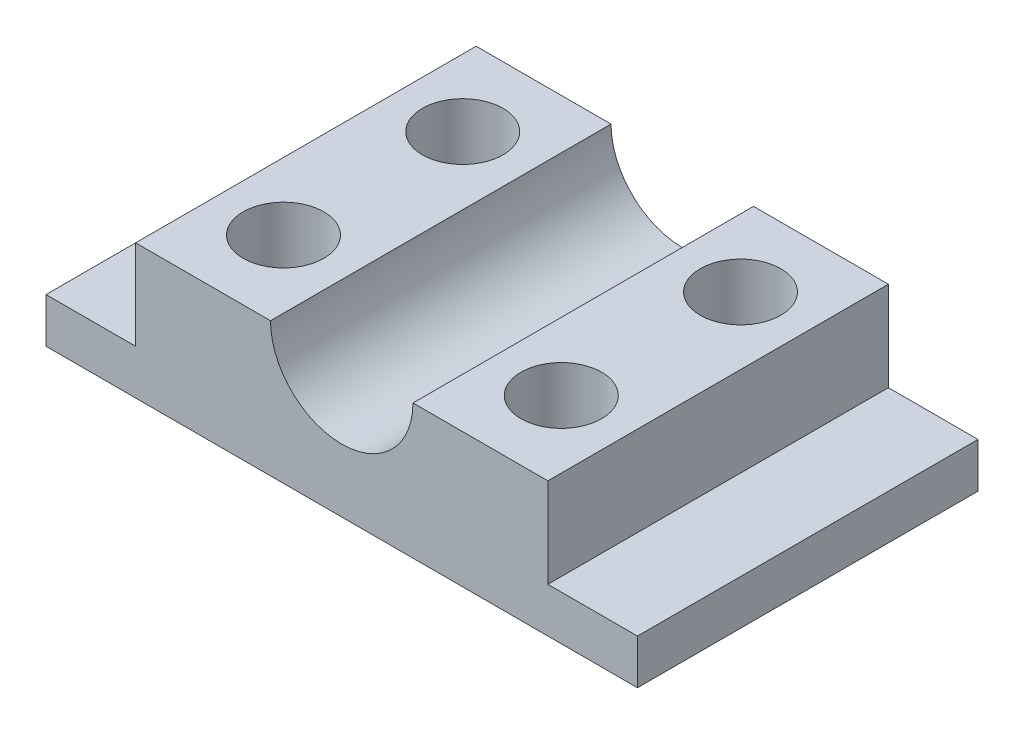
ISO-10303-21;
HEADER;
FILE_DESCRIPTION(('STEP AP214'),'2;1');
FILE_NAME('part.step','',(''),(''),'','','');
FILE_SCHEMA(('AUTOMOTIVE_DESIGN { 1 0 10303 214 1 1 1 1 }'));
ENDSEC;
DATA;
#1=APPLICATION_CONTEXT('core data for automotive mechanical design processes');
#2=APPLICATION_PROTOCOL_DEFINITION('international standard','automotive_design',2000,#1);
#3=PRODUCT_CONTEXT('',#1,'mechanical');
#4=PRODUCT('Part','Part','',(#3));
#5=PRODUCT_RELATED_PRODUCT_CATEGORY('part','',(#4));
#6=PRODUCT_DEFINITION_FORMATION('','',#4);
#7=PRODUCT_DEFINITION_CONTEXT('part definition',#1,'design');
#8=PRODUCT_DEFINITION('design','',#6,#7);
#9=PRODUCT_DEFINITION_SHAPE('','',#8);
#10=(LENGTH_UNIT() NAMED_UNIT(*) SI_UNIT(.MILLI.,.METRE.));
#11=(NAMED_UNIT(*) PLANE_ANGLE_UNIT() SI_UNIT($,.RADIAN.));
#12=(NAMED_UNIT(*) SI_UNIT($,.STERADIAN.) SOLID_ANGLE_UNIT());
#13=UNCERTAINTY_MEASURE_WITH_UNIT(LENGTH_MEASURE(1.E-05),#10,'distance_accuracy_value','');
#14=(GEOMETRIC_REPRESENTATION_CONTEXT(3) GLOBAL_UNCERTAINTY_ASSIGNED_CONTEXT((#13)) GLOBAL_UNIT_ASSIGNED_CONTEXT((#10,
#11,#12)) REPRESENTATION_CONTEXT('',''));
#15=CARTESIAN_POINT('',(0.,0.,0.));
#16=DIRECTION('',(0.,0.,1.));
#17=DIRECTION('',(1.,0.,0.));
#18=AXIS2_PLACEMENT_3D('',#15,#16,#17);
#19=CARTESIAN_POINT('',(0.,15.,0.));
#20=DIRECTION('',(1.,0.,0.));
#21=DIRECTION('',(0.,0.,-1.));
#22=AXIS2_PLACEMENT_3D('',#19,#20,#21);
#23=PLANE('',#22);
#24=DIRECTION('',(0.,0.,-1.));
#25=VECTOR('',#24,1.);
#26=CARTESIAN_POINT('',(0.,5.,-38.));
#27=LINE('',#26,#25);
#28=CARTESIAN_POINT('',(0.,5.,0.));
#29=VERTEX_POINT('',#28);
#30=CARTESIAN_POINT('',(0.,5.,-38.));
#31=VERTEX_POINT('',#30);
#32=EDGE_CURVE('E49',#29,#31,#27,.T.);
#33=ORIENTED_EDGE('',*,*,#32,.F.);
#34=DIRECTION('',(0.,-1.,0.));
#35=VECTOR('',#34,1.);
#36=CARTESIAN_POINT('',(0.,15.,0.));
#37=LINE('',#36,#35);
#38=CARTESIAN_POINT('',(0.,15.,0.));
#39=VERTEX_POINT('',#38);
#40=EDGE_CURVE('E212',#39,#29,#37,.T.);
#41=ORIENTED_EDGE('',*,*,#40,.F.);
#42=DIRECTION('',(0.,0.,1.));
#43=VECTOR('',#42,1.);
#44=CARTESIAN_POINT('',(0.,15.,0.));
#45=LINE('',#44,#43);
#46=CARTESIAN_POINT('',(0.,15.,-38.));
#47=VERTEX_POINT('',#46);
#48=EDGE_CURVE('E125',#47,#39,#45,.T.);
#49=ORIENTED_EDGE('',*,*,#48,.F.);
#50=DIRECTION('',(0.,-1.,0.));
#51=VECTOR('',#50,1.);
#52=CARTESIAN_POINT('',(0.,15.,-38.));
#53=LINE('',#52,#51);
#54=EDGE_CURVE('E205',#47,#31,#53,.T.);
#55=ORIENTED_EDGE('',*,*,#54,.T.);
#56=EDGE_LOOP('',(#33,#41,#49,#55));
#57=FACE_BOUND('',#56,.T.);
#58=ADVANCED_FACE('F35',(#57),#23,.F.);
#59=CARTESIAN_POINT('',(46.,15.,0.));
#60=DIRECTION('',(-1.,0.,0.));
#61=DIRECTION('',(0.,0.,1.));
#62=AXIS2_PLACEMENT_3D('',#59,#60,#61);
#63=PLANE('',#62);
#64=DIRECTION('',(0.,0.,1.));
#65=VECTOR('',#64,1.);
#66=CARTESIAN_POINT('',(46.,5.,0.));
#67=LINE('',#66,#65);
#68=CARTESIAN_POINT('',(46.,5.,-38.));
#69=VERTEX_POINT('',#68);
#70=CARTESIAN_POINT('',(46.,5.,0.));
#71=VERTEX_POINT('',#70);
#72=EDGE_CURVE('E57',#69,#71,#67,.T.);
#73=ORIENTED_EDGE('',*,*,#72,.F.);
#74=DIRECTION('',(0.,-1.,0.));
#75=VECTOR('',#74,1.);
#76=CARTESIAN_POINT('',(46.,15.,-38.));
#77=LINE('',#76,#75);
#78=CARTESIAN_POINT('',(46.,15.,-38.));
#79=VERTEX_POINT('',#78);
#80=EDGE_CURVE('E208',#79,#69,#77,.T.);
#81=ORIENTED_EDGE('',*,*,#80,.F.);
#82=DIRECTION('',(0.,0.,-1.));
#83=VECTOR('',#82,1.);
#84=CARTESIAN_POINT('',(46.,15.,0.));
#85=LINE('',#84,#83);
#86=CARTESIAN_POINT('',(46.,15.,0.));
#87=VERTEX_POINT('',#86);
#88=EDGE_CURVE('E199',#87,#79,#85,.T.);
#89=ORIENTED_EDGE('',*,*,#88,.F.);
#90=DIRECTION('',(0.,-1.,0.));
#91=VECTOR('',#90,1.);
#92=CARTESIAN_POINT('',(46.,15.,0.));
#93=LINE('',#92,#91);
#94=EDGE_CURVE('E210',#87,#71,#93,.T.);
#95=ORIENTED_EDGE('',*,*,#94,.T.);
#96=EDGE_LOOP('',(#73,#81,#89,#95));
#97=FACE_BOUND('',#96,.T.);
#98=ADVANCED_FACE('F239',(#97),#63,.F.);
#99=CARTESIAN_POINT('',(0.,15.,0.));
#100=DIRECTION('',(0.,-1.,0.));
#101=DIRECTION('',(0.,0.,-1.));
#102=AXIS2_PLACEMENT_3D('',#99,#100,#101);
#103=PLANE('',#102);
#104=CARTESIAN_POINT('',(38.5,15.,-9.));
#105=DIRECTION('',(0.,1.,0.));
#106=DIRECTION('',(0.,0.,1.));
#107=AXIS2_PLACEMENT_3D('',#104,#105,#106);
#108=CIRCLE('',#107,4.5);
#109=CARTESIAN_POINT('',(38.5,15.,-4.5));
#110=VERTEX_POINT('',#109);
#111=EDGE_CURVE('E181',#110,#110,#108,.T.);
#112=ORIENTED_EDGE('',*,*,#111,.F.);
#113=EDGE_LOOP('',(#112));
#114=FACE_BOUND('',#113,.T.);
#115=CARTESIAN_POINT('',(38.5,15.,-29.));
#116=DIRECTION('',(0.,1.,0.));
#117=DIRECTION('',(0.,0.,1.));
#118=AXIS2_PLACEMENT_3D('',#115,#116,#117);
#119=CIRCLE('',#118,4.5);
#120=CARTESIAN_POINT('',(38.5,15.,-24.5));
#121=VERTEX_POINT('',#120);
#122=EDGE_CURVE('E175',#121,#121,#119,.T.);
#123=ORIENTED_EDGE('',*,*,#122,.F.);
#124=EDGE_LOOP('',(#123));
#125=FACE_BOUND('',#124,.T.);
#126=DIRECTION('',(-1.,0.,0.));
#127=VECTOR('',#126,1.);
#128=CARTESIAN_POINT('',(0.,15.,-38.));
#129=LINE('',#128,#127);
#130=CARTESIAN_POINT('',(30.95,15.,-38.));
#131=VERTEX_POINT('',#130);
#132=EDGE_CURVE('E202',#79,#131,#129,.T.);
#133=ORIENTED_EDGE('',*,*,#132,.T.);
#134=DIRECTION('',(0.,0.,1.));
#135=VECTOR('',#134,1.);
#136=CARTESIAN_POINT('',(30.95,15.,-38.));
#137=LINE('',#136,#135);
#138=CARTESIAN_POINT('',(30.95,15.,0.));
#139=VERTEX_POINT('',#138);
#140=EDGE_CURVE('E11',#131,#139,#137,.T.);
#141=ORIENTED_EDGE('',*,*,#140,.T.);
#142=DIRECTION('',(1.,0.,0.));
#143=VECTOR('',#142,1.);
#144=CARTESIAN_POINT('',(0.,15.,0.));
#145=LINE('',#144,#143);
#146=EDGE_CURVE('E195',#139,#87,#145,.T.);
#147=ORIENTED_EDGE('',*,*,#146,.T.);
#148=ORIENTED_EDGE('',*,*,#88,.T.);
#149=EDGE_LOOP('',(#133,#141,#147,#148));
#150=FACE_BOUND('',#149,.T.);
#151=ADVANCED_FACE('F243',(#114,#125,#150),#103,.F.);
#152=CARTESIAN_POINT('',(0.,15.,0.));
#153=DIRECTION('',(0.,0.,-1.));
#154=DIRECTION('',(-1.,0.,0.));
#155=AXIS2_PLACEMENT_3D('',#152,#153,#154);
#156=PLANE('',#155);
#157=ORIENTED_EDGE('',*,*,#146,.F.);
#158=CARTESIAN_POINT('',(23.,15.,0.));
#159=DIRECTION('',(0.,0.,1.));
#160=DIRECTION('',(1.,0.,0.));
#161=AXIS2_PLACEMENT_3D('',#158,#159,#160);
#162=CIRCLE('',#161,7.95);
#163=CARTESIAN_POINT('',(15.05,15.,0.));
#164=VERTEX_POINT('',#163);
#165=EDGE_CURVE('E164',#164,#139,#162,.T.);
#166=ORIENTED_EDGE('',*,*,#165,.F.);
#167=EDGE_CURVE('E196',#39,#164,#145,.T.);
#168=ORIENTED_EDGE('',*,*,#167,.F.);
#169=ORIENTED_EDGE('',*,*,#40,.T.);
#170=DIRECTION('',(1.,0.,0.));
#171=VECTOR('',#170,1.);
#172=CARTESIAN_POINT('',(-10.,5.,0.));
#173=LINE('',#172,#171);
#174=CARTESIAN_POINT('',(-10.,5.,0.));
#175=VERTEX_POINT('',#174);
#176=EDGE_CURVE('E146',#175,#29,#173,.T.);
#177=ORIENTED_EDGE('',*,*,#176,.F.);
#178=DIRECTION('',(0.,1.,0.));
#179=VECTOR('',#178,1.);
#180=CARTESIAN_POINT('',(-10.,0.,0.));
#181=LINE('',#180,#179);
#182=CARTESIAN_POINT('',(-10.,0.,0.));
#183=VERTEX_POINT('',#182);
#184=EDGE_CURVE('E133',#183,#175,#181,.T.);
#185=ORIENTED_EDGE('',*,*,#184,.F.);
#186=DIRECTION('',(1.,0.,0.));
#187=VECTOR('',#186,1.);
#188=CARTESIAN_POINT('',(0.,0.,0.));
#189=LINE('',#188,#187);
#190=CARTESIAN_POINT('',(56.,0.,0.));
#191=VERTEX_POINT('',#190);
#192=EDGE_CURVE('E126',#183,#191,#189,.T.);
#193=ORIENTED_EDGE('',*,*,#192,.T.);
#194=DIRECTION('',(0.,-1.,0.));
#195=VECTOR('',#194,1.);
#196=CARTESIAN_POINT('',(56.,0.,0.));
#197=LINE('',#196,#195);
#198=CARTESIAN_POINT('',(56.,5.,0.));
#199=VERTEX_POINT('',#198);
#200=EDGE_CURVE('E149',#199,#191,#197,.T.);
#201=ORIENTED_EDGE('',*,*,#200,.F.);
#202=DIRECTION('',(-1.,0.,0.));
#203=VECTOR('',#202,1.);
#204=CARTESIAN_POINT('',(56.,5.,0.));
#205=LINE('',#204,#203);
#206=EDGE_CURVE('E157',#199,#71,#205,.T.);
#207=ORIENTED_EDGE('',*,*,#206,.T.);
#208=ORIENTED_EDGE('',*,*,#94,.F.);
#209=EDGE_LOOP('',(#157,#166,#168,#169,#177,#185,#193,#201,#207,#208));
#210=FACE_BOUND('',#209,.T.);
#211=ADVANCED_FACE('F224',(#210),#156,.F.);
#212=CARTESIAN_POINT('',(0.,15.,-38.));
#213=DIRECTION('',(0.,0.,1.));
#214=DIRECTION('',(1.,0.,0.));
#215=AXIS2_PLACEMENT_3D('',#212,#213,#214);
#216=PLANE('',#215);
#217=CARTESIAN_POINT('',(15.05,15.,-38.));
#218=VERTEX_POINT('',#217);
#219=EDGE_CURVE('E201',#218,#47,#129,.T.);
#220=ORIENTED_EDGE('',*,*,#219,.F.);
#221=CARTESIAN_POINT('',(23.,15.,-38.));
#222=DIRECTION('',(0.,0.,1.));
#223=DIRECTION('',(1.,0.,0.));
#224=AXIS2_PLACEMENT_3D('',#221,#222,#223);
#225=CIRCLE('',#224,7.95);
#226=EDGE_CURVE('E165',#218,#131,#225,.T.);
#227=ORIENTED_EDGE('',*,*,#226,.T.);
#228=ORIENTED_EDGE('',*,*,#132,.F.);
#229=ORIENTED_EDGE('',*,*,#80,.T.);
#230=DIRECTION('',(-1.,0.,0.));
#231=VECTOR('',#230,1.);
#232=CARTESIAN_POINT('',(56.,5.,-38.));
#233=LINE('',#232,#231);
#234=CARTESIAN_POINT('',(56.,5.,-38.));
#235=VERTEX_POINT('',#234);
#236=EDGE_CURVE('E161',#235,#69,#233,.T.);
#237=ORIENTED_EDGE('',*,*,#236,.F.);
#238=DIRECTION('',(0.,1.,0.));
#239=VECTOR('',#238,1.);
#240=CARTESIAN_POINT('',(56.,0.,-38.));
#241=LINE('',#240,#239);
#242=CARTESIAN_POINT('',(56.,0.,-38.));
#243=VERTEX_POINT('',#242);
#244=EDGE_CURVE('E121',#243,#235,#241,.T.);
#245=ORIENTED_EDGE('',*,*,#244,.F.);
#246=DIRECTION('',(-1.,0.,0.));
#247=VECTOR('',#246,1.);
#248=CARTESIAN_POINT('',(0.,0.,-38.));
#249=LINE('',#248,#247);
#250=CARTESIAN_POINT('',(-10.,0.,-38.));
#251=VERTEX_POINT('',#250);
#252=EDGE_CURVE('E113',#243,#251,#249,.T.);
#253=ORIENTED_EDGE('',*,*,#252,.T.);
#254=DIRECTION('',(0.,-1.,0.));
#255=VECTOR('',#254,1.);
#256=CARTESIAN_POINT('',(-10.,0.,-38.));
#257=LINE('',#256,#255);
#258=CARTESIAN_POINT('',(-10.,5.,-38.));
#259=VERTEX_POINT('',#258);
#260=EDGE_CURVE('E119',#259,#251,#257,.T.);
#261=ORIENTED_EDGE('',*,*,#260,.F.);
#262=DIRECTION('',(1.,0.,0.));
#263=VECTOR('',#262,1.);
#264=CARTESIAN_POINT('',(-10.,5.,-38.));
#265=LINE('',#264,#263);
#266=EDGE_CURVE('E143',#259,#31,#265,.T.);
#267=ORIENTED_EDGE('',*,*,#266,.T.);
#268=ORIENTED_EDGE('',*,*,#54,.F.);
#269=EDGE_LOOP('',(#220,#227,#228,#229,#237,#245,#253,#261,#267,#268));
#270=FACE_BOUND('',#269,.T.);
#271=ADVANCED_FACE('F116',(#270),#216,.F.);
#272=CARTESIAN_POINT('',(7.5,15.,-29.));
#273=DIRECTION('',(0.,1.,0.));
#274=DIRECTION('',(0.,0.,1.));
#275=AXIS2_PLACEMENT_3D('',#272,#273,#274);
#276=CIRCLE('',#275,4.5);
#277=CARTESIAN_POINT('',(7.5,15.,-24.5));
#278=VERTEX_POINT('',#277);
#279=EDGE_CURVE('E168',#278,#278,#276,.T.);
#280=ORIENTED_EDGE('',*,*,#279,.F.);
#281=EDGE_LOOP('',(#280));
#282=FACE_BOUND('',#281,.T.);
#283=CARTESIAN_POINT('',(7.5,15.,-9.));
#284=DIRECTION('',(0.,1.,0.));
#285=DIRECTION('',(0.,0.,1.));
#286=AXIS2_PLACEMENT_3D('',#283,#284,#285);
#287=CIRCLE('',#286,4.5);
#288=CARTESIAN_POINT('',(7.5,15.,-4.5));
#289=VERTEX_POINT('',#288);
#290=EDGE_CURVE('E187',#289,#289,#287,.T.);
#291=ORIENTED_EDGE('',*,*,#290,.F.);
#292=EDGE_LOOP('',(#291));
#293=FACE_BOUND('',#292,.T.);
#294=ORIENTED_EDGE('',*,*,#167,.T.);
#295=DIRECTION('',(0.,0.,1.));
#296=VECTOR('',#295,1.);
#297=CARTESIAN_POINT('',(15.05,15.,-38.));
#298=LINE('',#297,#296);
#299=EDGE_CURVE('E42',#164,#218,#298,.F.);
#300=ORIENTED_EDGE('',*,*,#299,.T.);
#301=ORIENTED_EDGE('',*,*,#219,.T.);
#302=ORIENTED_EDGE('',*,*,#48,.T.);
#303=EDGE_LOOP('',(#294,#300,#301,#302));
#304=FACE_BOUND('',#303,.T.);
#305=ADVANCED_FACE('F215',(#282,#293,#304),#103,.F.);
#306=CARTESIAN_POINT('',(0.,0.,0.));
#307=DIRECTION('',(0.,-1.,0.));
#308=DIRECTION('',(0.,0.,-1.));
#309=AXIS2_PLACEMENT_3D('',#306,#307,#308);
#310=PLANE('',#309);
#311=CARTESIAN_POINT('',(7.5,0.,-29.));
#312=DIRECTION('',(0.,1.,0.));
#313=DIRECTION('',(0.,0.,1.));
#314=AXIS2_PLACEMENT_3D('',#311,#312,#313);
#315=CIRCLE('',#314,4.5);
#316=CARTESIAN_POINT('',(7.5,0.,-24.5));
#317=VERTEX_POINT('',#316);
#318=EDGE_CURVE('E172',#317,#317,#315,.T.);
#319=ORIENTED_EDGE('',*,*,#318,.T.);
#320=EDGE_LOOP('',(#319));
#321=FACE_BOUND('',#320,.T.);
#322=CARTESIAN_POINT('',(38.5,0.,-29.));
#323=DIRECTION('',(0.,1.,0.));
#324=DIRECTION('',(0.,0.,1.));
#325=AXIS2_PLACEMENT_3D('',#322,#323,#324);
#326=CIRCLE('',#325,4.5);
#327=CARTESIAN_POINT('',(38.5,0.,-24.5));
#328=VERTEX_POINT('',#327);
#329=EDGE_CURVE('E178',#328,#328,#326,.T.);
#330=ORIENTED_EDGE('',*,*,#329,.T.);
#331=EDGE_LOOP('',(#330));
#332=FACE_BOUND('',#331,.T.);
#333=CARTESIAN_POINT('',(38.5,0.,-9.));
#334=DIRECTION('',(0.,1.,0.));
#335=DIRECTION('',(0.,0.,1.));
#336=AXIS2_PLACEMENT_3D('',#333,#334,#335);
#337=CIRCLE('',#336,4.5);
#338=CARTESIAN_POINT('',(38.5,0.,-4.5));
#339=VERTEX_POINT('',#338);
#340=EDGE_CURVE('E184',#339,#339,#337,.T.);
#341=ORIENTED_EDGE('',*,*,#340,.T.);
#342=EDGE_LOOP('',(#341));
#343=FACE_BOUND('',#342,.T.);
#344=CARTESIAN_POINT('',(7.5,0.,-9.));
#345=DIRECTION('',(0.,1.,0.));
#346=DIRECTION('',(0.,0.,1.));
#347=AXIS2_PLACEMENT_3D('',#344,#345,#346);
#348=CIRCLE('',#347,4.5);
#349=CARTESIAN_POINT('',(7.5,0.,-4.5));
#350=VERTEX_POINT('',#349);
#351=EDGE_CURVE('E190',#350,#350,#348,.T.);
#352=ORIENTED_EDGE('',*,*,#351,.T.);
#353=EDGE_LOOP('',(#352));
#354=FACE_BOUND('',#353,.T.);
#355=ORIENTED_EDGE('',*,*,#192,.F.);
#356=DIRECTION('',(0.,0.,1.));
#357=VECTOR('',#356,1.);
#358=CARTESIAN_POINT('',(-10.,0.,-38.));
#359=LINE('',#358,#357);
#360=EDGE_CURVE('E129',#251,#183,#359,.T.);
#361=ORIENTED_EDGE('',*,*,#360,.F.);
#362=ORIENTED_EDGE('',*,*,#252,.F.);
#363=DIRECTION('',(0.,0.,-1.));
#364=VECTOR('',#363,1.);
#365=CARTESIAN_POINT('',(56.,0.,0.));
#366=LINE('',#365,#364);
#367=EDGE_CURVE('E152',#191,#243,#366,.T.);
#368=ORIENTED_EDGE('',*,*,#367,.F.);
#369=EDGE_LOOP('',(#355,#361,#362,#368));
#370=FACE_BOUND('',#369,.T.);
#371=ADVANCED_FACE('F130',(#321,#332,#343,#354,#370),#310,.T.);
#372=CARTESIAN_POINT('',(7.5,15.,-9.));
#373=DIRECTION('',(0.,1.,0.));
#374=DIRECTION('',(0.,0.,1.));
#375=AXIS2_PLACEMENT_3D('',#372,#373,#374);
#376=CYLINDRICAL_SURFACE('',#375,4.5);
#377=ORIENTED_EDGE('',*,*,#351,.F.);
#378=EDGE_LOOP('',(#377));
#379=FACE_BOUND('',#378,.T.);
#380=ORIENTED_EDGE('',*,*,#290,.T.);
#381=EDGE_LOOP('',(#380));
#382=FACE_BOUND('',#381,.T.);
#383=ADVANCED_FACE('F263',(#379,#382),#376,.F.);
#384=CARTESIAN_POINT('',(38.5,15.,-9.));
#385=DIRECTION('',(0.,1.,0.));
#386=DIRECTION('',(0.,0.,1.));
#387=AXIS2_PLACEMENT_3D('',#384,#385,#386);
#388=CYLINDRICAL_SURFACE('',#387,4.5);
#389=ORIENTED_EDGE('',*,*,#340,.F.);
#390=EDGE_LOOP('',(#389));
#391=FACE_BOUND('',#390,.T.);
#392=ORIENTED_EDGE('',*,*,#111,.T.);
#393=EDGE_LOOP('',(#392));
#394=FACE_BOUND('',#393,.T.);
#395=ADVANCED_FACE('F270',(#391,#394),#388,.F.);
#396=CARTESIAN_POINT('',(38.5,15.,-29.));
#397=DIRECTION('',(0.,1.,0.));
#398=DIRECTION('',(0.,0.,1.));
#399=AXIS2_PLACEMENT_3D('',#396,#397,#398);
#400=CYLINDRICAL_SURFACE('',#399,4.5);
#401=ORIENTED_EDGE('',*,*,#329,.F.);
#402=EDGE_LOOP('',(#401));
#403=FACE_BOUND('',#402,.T.);
#404=ORIENTED_EDGE('',*,*,#122,.T.);
#405=EDGE_LOOP('',(#404));
#406=FACE_BOUND('',#405,.T.);
#407=ADVANCED_FACE('F274',(#403,#406),#400,.F.);
#408=CARTESIAN_POINT('',(7.5,15.,-29.));
#409=DIRECTION('',(0.,1.,0.));
#410=DIRECTION('',(0.,0.,1.));
#411=AXIS2_PLACEMENT_3D('',#408,#409,#410);
#412=CYLINDRICAL_SURFACE('',#411,4.5);
#413=ORIENTED_EDGE('',*,*,#318,.F.);
#414=EDGE_LOOP('',(#413));
#415=FACE_BOUND('',#414,.T.);
#416=ORIENTED_EDGE('',*,*,#279,.T.);
#417=EDGE_LOOP('',(#416));
#418=FACE_BOUND('',#417,.T.);
#419=ADVANCED_FACE('F278',(#415,#418),#412,.F.);
#420=CARTESIAN_POINT('',(23.,15.,-38.));
#421=DIRECTION('',(0.,0.,1.));
#422=DIRECTION('',(1.,0.,0.));
#423=AXIS2_PLACEMENT_3D('',#420,#421,#422);
#424=CYLINDRICAL_SURFACE('',#423,7.95);
#425=ORIENTED_EDGE('',*,*,#226,.F.);
#426=ORIENTED_EDGE('',*,*,#299,.F.);
#427=ORIENTED_EDGE('',*,*,#165,.T.);
#428=ORIENTED_EDGE('',*,*,#140,.F.);
#429=EDGE_LOOP('',(#425,#426,#427,#428));
#430=FACE_BOUND('',#429,.T.);
#431=ADVANCED_FACE('F282',(#430),#424,.F.);
#432=CARTESIAN_POINT('',(56.,5.,0.));
#433=DIRECTION('',(0.,-1.,0.));
#434=DIRECTION('',(0.,0.,-1.));
#435=AXIS2_PLACEMENT_3D('',#432,#433,#434);
#436=PLANE('',#435);
#437=ORIENTED_EDGE('',*,*,#72,.T.);
#438=ORIENTED_EDGE('',*,*,#206,.F.);
#439=DIRECTION('',(0.,0.,1.));
#440=VECTOR('',#439,1.);
#441=CARTESIAN_POINT('',(56.,5.,0.));
#442=LINE('',#441,#440);
#443=EDGE_CURVE('E155',#235,#199,#442,.T.);
#444=ORIENTED_EDGE('',*,*,#443,.F.);
#445=ORIENTED_EDGE('',*,*,#236,.T.);
#446=EDGE_LOOP('',(#437,#438,#444,#445));
#447=FACE_BOUND('',#446,.T.);
#448=ADVANCED_FACE('F235',(#447),#436,.F.);
#449=CARTESIAN_POINT('',(56.,0.,0.));
#450=DIRECTION('',(-1.,0.,0.));
#451=DIRECTION('',(0.,0.,1.));
#452=AXIS2_PLACEMENT_3D('',#449,#450,#451);
#453=PLANE('',#452);
#454=ORIENTED_EDGE('',*,*,#200,.T.);
#455=ORIENTED_EDGE('',*,*,#367,.T.);
#456=ORIENTED_EDGE('',*,*,#244,.T.);
#457=ORIENTED_EDGE('',*,*,#443,.T.);
#458=EDGE_LOOP('',(#454,#455,#456,#457));
#459=FACE_BOUND('',#458,.T.);
#460=ADVANCED_FACE('F228',(#459),#453,.F.);
#461=CARTESIAN_POINT('',(-10.,5.,-38.));
#462=DIRECTION('',(0.,-1.,0.));
#463=DIRECTION('',(0.,0.,-1.));
#464=AXIS2_PLACEMENT_3D('',#461,#462,#463);
#465=PLANE('',#464);
#466=ORIENTED_EDGE('',*,*,#32,.T.);
#467=ORIENTED_EDGE('',*,*,#266,.F.);
#468=DIRECTION('',(0.,0.,-1.));
#469=VECTOR('',#468,1.);
#470=CARTESIAN_POINT('',(-10.,5.,-38.));
#471=LINE('',#470,#469);
#472=EDGE_CURVE('E137',#175,#259,#471,.T.);
#473=ORIENTED_EDGE('',*,*,#472,.F.);
#474=ORIENTED_EDGE('',*,*,#176,.T.);
#475=EDGE_LOOP('',(#466,#467,#473,#474));
#476=FACE_BOUND('',#475,.T.);
#477=ADVANCED_FACE('F226',(#476),#465,.F.);
#478=CARTESIAN_POINT('',(-10.,0.,0.));
#479=DIRECTION('',(1.,0.,0.));
#480=DIRECTION('',(0.,0.,-1.));
#481=AXIS2_PLACEMENT_3D('',#478,#479,#480);
#482=PLANE('',#481);
#483=ORIENTED_EDGE('',*,*,#260,.T.);
#484=ORIENTED_EDGE('',*,*,#360,.T.);
#485=ORIENTED_EDGE('',*,*,#184,.T.);
#486=ORIENTED_EDGE('',*,*,#472,.T.);
#487=EDGE_LOOP('',(#483,#484,#485,#486));
#488=FACE_BOUND('',#487,.T.);
#489=ADVANCED_FACE('F135',(#488),#482,.F.);
#490=CLOSED_SHELL('',(#58,#98,#151,#211,#271,#305,#371,#383,#395,#407,#419,#431,#448,#460,#477,#489));
#491=MANIFOLD_SOLID_BREP('B2',#490);
#492=ADVANCED_BREP_SHAPE_REPRESENTATION('',(#18,#491),#14);
#493=SHAPE_DEFINITION_REPRESENTATION(#9,#492);
ENDSEC;
END-ISO-10303-21;
